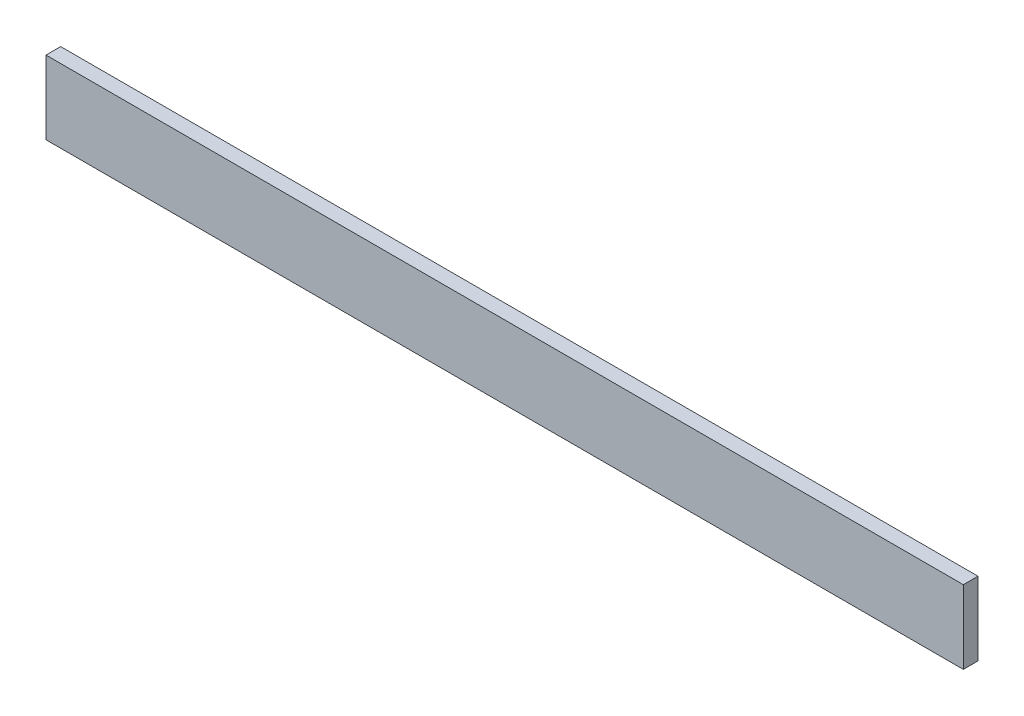
ISO-10303-21;
HEADER;
FILE_DESCRIPTION(('STEP AP214'),'2;1');
FILE_NAME('part.step','',(''),(''),'','','');
FILE_SCHEMA(('AUTOMOTIVE_DESIGN { 1 0 10303 214 1 1 1 1 }'));
ENDSEC;
DATA;
#1=APPLICATION_CONTEXT('core data for automotive mechanical design processes');
#2=APPLICATION_PROTOCOL_DEFINITION('international standard','automotive_design',2000,#1);
#3=PRODUCT_CONTEXT('',#1,'mechanical');
#4=PRODUCT('Part','Part','',(#3));
#5=PRODUCT_RELATED_PRODUCT_CATEGORY('part','',(#4));
#6=PRODUCT_DEFINITION_FORMATION('','',#4);
#7=PRODUCT_DEFINITION_CONTEXT('part definition',#1,'design');
#8=PRODUCT_DEFINITION('design','',#6,#7);
#9=PRODUCT_DEFINITION_SHAPE('','',#8);
#10=(LENGTH_UNIT() NAMED_UNIT(*) SI_UNIT(.MILLI.,.METRE.));
#11=(NAMED_UNIT(*) PLANE_ANGLE_UNIT() SI_UNIT($,.RADIAN.));
#12=(NAMED_UNIT(*) SI_UNIT($,.STERADIAN.) SOLID_ANGLE_UNIT());
#13=UNCERTAINTY_MEASURE_WITH_UNIT(LENGTH_MEASURE(1.E-05),#10,'distance_accuracy_value','');
#14=(GEOMETRIC_REPRESENTATION_CONTEXT(3) GLOBAL_UNCERTAINTY_ASSIGNED_CONTEXT((#13)) GLOBAL_UNIT_ASSIGNED_CONTEXT((#10,
#11,#12)) REPRESENTATION_CONTEXT('',''));
#15=CARTESIAN_POINT('',(0.,0.,0.));
#16=DIRECTION('',(0.,0.,1.));
#17=DIRECTION('',(1.,0.,0.));
#18=AXIS2_PLACEMENT_3D('',#15,#16,#17);
#19=CARTESIAN_POINT('',(0.,0.,8.));
#20=DIRECTION('',(1.,0.,0.));
#21=DIRECTION('',(0.,0.,-1.));
#22=AXIS2_PLACEMENT_3D('',#19,#20,#21);
#23=PLANE('',#22);
#24=DIRECTION('',(0.,-1.,0.));
#25=VECTOR('',#24,1.);
#26=CARTESIAN_POINT('',(0.,0.,0.));
#27=LINE('',#26,#25);
#28=CARTESIAN_POINT('',(0.,40.,0.));
#29=VERTEX_POINT('',#28);
#30=CARTESIAN_POINT('',(0.,0.,0.));
#31=VERTEX_POINT('',#30);
#32=EDGE_CURVE('E96',#29,#31,#27,.T.);
#33=ORIENTED_EDGE('',*,*,#32,.T.);
#34=DIRECTION('',(0.,0.,-1.));
#35=VECTOR('',#34,1.);
#36=CARTESIAN_POINT('',(0.,0.,8.));
#37=LINE('',#36,#35);
#38=CARTESIAN_POINT('',(0.,0.,8.));
#39=VERTEX_POINT('',#38);
#40=EDGE_CURVE('E11',#39,#31,#37,.T.);
#41=ORIENTED_EDGE('',*,*,#40,.F.);
#42=DIRECTION('',(0.,-1.,0.));
#43=VECTOR('',#42,1.);
#44=CARTESIAN_POINT('',(0.,0.,8.));
#45=LINE('',#44,#43);
#46=CARTESIAN_POINT('',(0.,40.,8.));
#47=VERTEX_POINT('',#46);
#48=EDGE_CURVE('E84',#47,#39,#45,.T.);
#49=ORIENTED_EDGE('',*,*,#48,.F.);
#50=DIRECTION('',(0.,0.,-1.));
#51=VECTOR('',#50,1.);
#52=CARTESIAN_POINT('',(0.,40.,8.));
#53=LINE('',#52,#51);
#54=EDGE_CURVE('E92',#47,#29,#53,.T.);
#55=ORIENTED_EDGE('',*,*,#54,.T.);
#56=EDGE_LOOP('',(#33,#41,#49,#55));
#57=FACE_BOUND('',#56,.T.);
#58=ADVANCED_FACE('F33',(#57),#23,.F.);
#59=CARTESIAN_POINT('',(0.,0.,8.));
#60=DIRECTION('',(0.,1.,0.));
#61=DIRECTION('',(0.,0.,1.));
#62=AXIS2_PLACEMENT_3D('',#59,#60,#61);
#63=PLANE('',#62);
#64=DIRECTION('',(1.,0.,0.));
#65=VECTOR('',#64,1.);
#66=CARTESIAN_POINT('',(0.,0.,0.));
#67=LINE('',#66,#65);
#68=CARTESIAN_POINT('',(500.,0.,0.));
#69=VERTEX_POINT('',#68);
#70=EDGE_CURVE('E88',#31,#69,#67,.T.);
#71=ORIENTED_EDGE('',*,*,#70,.T.);
#72=DIRECTION('',(0.,0.,-1.));
#73=VECTOR('',#72,1.);
#74=CARTESIAN_POINT('',(500.,0.,8.));
#75=LINE('',#74,#73);
#76=CARTESIAN_POINT('',(500.,0.,8.));
#77=VERTEX_POINT('',#76);
#78=EDGE_CURVE('E41',#77,#69,#75,.T.);
#79=ORIENTED_EDGE('',*,*,#78,.F.);
#80=DIRECTION('',(1.,0.,0.));
#81=VECTOR('',#80,1.);
#82=CARTESIAN_POINT('',(0.,0.,8.));
#83=LINE('',#82,#81);
#84=EDGE_CURVE('E79',#39,#77,#83,.T.);
#85=ORIENTED_EDGE('',*,*,#84,.F.);
#86=ORIENTED_EDGE('',*,*,#40,.T.);
#87=EDGE_LOOP('',(#71,#79,#85,#86));
#88=FACE_BOUND('',#87,.T.);
#89=ADVANCED_FACE('F87',(#88),#63,.F.);
#90=CARTESIAN_POINT('',(500.,0.,8.));
#91=DIRECTION('',(-1.,0.,0.));
#92=DIRECTION('',(0.,0.,1.));
#93=AXIS2_PLACEMENT_3D('',#90,#91,#92);
#94=PLANE('',#93);
#95=DIRECTION('',(0.,1.,0.));
#96=VECTOR('',#95,1.);
#97=CARTESIAN_POINT('',(500.,0.,0.));
#98=LINE('',#97,#96);
#99=CARTESIAN_POINT('',(500.,40.,0.));
#100=VERTEX_POINT('',#99);
#101=EDGE_CURVE('E66',#69,#100,#98,.T.);
#102=ORIENTED_EDGE('',*,*,#101,.T.);
#103=DIRECTION('',(0.,0.,-1.));
#104=VECTOR('',#103,1.);
#105=CARTESIAN_POINT('',(500.,40.,8.));
#106=LINE('',#105,#104);
#107=CARTESIAN_POINT('',(500.,40.,8.));
#108=VERTEX_POINT('',#107);
#109=EDGE_CURVE('E89',#108,#100,#106,.T.);
#110=ORIENTED_EDGE('',*,*,#109,.F.);
#111=DIRECTION('',(0.,1.,0.));
#112=VECTOR('',#111,1.);
#113=CARTESIAN_POINT('',(500.,0.,8.));
#114=LINE('',#113,#112);
#115=EDGE_CURVE('E82',#77,#108,#114,.T.);
#116=ORIENTED_EDGE('',*,*,#115,.F.);
#117=ORIENTED_EDGE('',*,*,#78,.T.);
#118=EDGE_LOOP('',(#102,#110,#116,#117));
#119=FACE_BOUND('',#118,.T.);
#120=ADVANCED_FACE('F90',(#119),#94,.F.);
#121=CARTESIAN_POINT('',(0.,40.,8.));
#122=DIRECTION('',(0.,-1.,0.));
#123=DIRECTION('',(0.,0.,-1.));
#124=AXIS2_PLACEMENT_3D('',#121,#122,#123);
#125=PLANE('',#124);
#126=DIRECTION('',(-1.,0.,0.));
#127=VECTOR('',#126,1.);
#128=CARTESIAN_POINT('',(0.,40.,0.));
#129=LINE('',#128,#127);
#130=EDGE_CURVE('E72',#100,#29,#129,.T.);
#131=ORIENTED_EDGE('',*,*,#130,.T.);
#132=ORIENTED_EDGE('',*,*,#54,.F.);
#133=DIRECTION('',(-1.,0.,0.));
#134=VECTOR('',#133,1.);
#135=CARTESIAN_POINT('',(0.,40.,8.));
#136=LINE('',#135,#134);
#137=EDGE_CURVE('E49',#108,#47,#136,.T.);
#138=ORIENTED_EDGE('',*,*,#137,.F.);
#139=ORIENTED_EDGE('',*,*,#109,.T.);
#140=EDGE_LOOP('',(#131,#132,#138,#139));
#141=FACE_BOUND('',#140,.T.);
#142=ADVANCED_FACE('F103',(#141),#125,.F.);
#143=CARTESIAN_POINT('',(0.,0.,8.));
#144=DIRECTION('',(0.,0.,-1.));
#145=DIRECTION('',(-1.,0.,0.));
#146=AXIS2_PLACEMENT_3D('',#143,#144,#145);
#147=PLANE('',#146);
#148=ORIENTED_EDGE('',*,*,#48,.T.);
#149=ORIENTED_EDGE('',*,*,#84,.T.);
#150=ORIENTED_EDGE('',*,*,#115,.T.);
#151=ORIENTED_EDGE('',*,*,#137,.T.);
#152=EDGE_LOOP('',(#148,#149,#150,#151));
#153=FACE_BOUND('',#152,.T.);
#154=ADVANCED_FACE('F80',(#153),#147,.F.);
#155=CARTESIAN_POINT('',(0.,0.,0.));
#156=DIRECTION('',(0.,0.,-1.));
#157=DIRECTION('',(-1.,0.,0.));
#158=AXIS2_PLACEMENT_3D('',#155,#156,#157);
#159=PLANE('',#158);
#160=ORIENTED_EDGE('',*,*,#32,.F.);
#161=ORIENTED_EDGE('',*,*,#130,.F.);
#162=ORIENTED_EDGE('',*,*,#101,.F.);
#163=ORIENTED_EDGE('',*,*,#70,.F.);
#164=EDGE_LOOP('',(#160,#161,#162,#163));
#165=FACE_BOUND('',#164,.T.);
#166=ADVANCED_FACE('F106',(#165),#159,.T.);
#167=CLOSED_SHELL('',(#58,#89,#120,#142,#154,#166));
#168=MANIFOLD_SOLID_BREP('B2',#167);
#169=ADVANCED_BREP_SHAPE_REPRESENTATION('',(#18,#168),#14);
#170=SHAPE_DEFINITION_REPRESENTATION(#9,#169);
ENDSEC;
END-ISO-10303-21;
